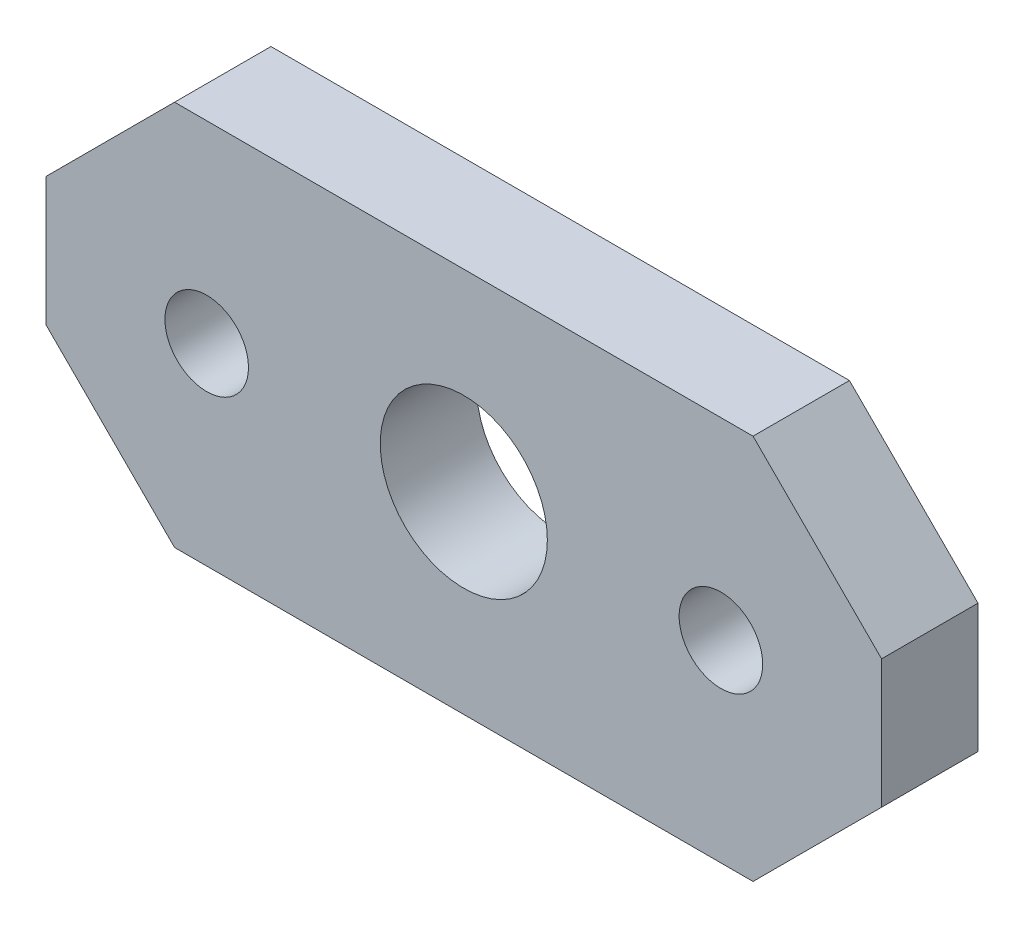
ISO-10303-21;
HEADER;
FILE_DESCRIPTION(('STEP AP214'),'2;1');
FILE_NAME('part.step','',(''),(''),'','','');
FILE_SCHEMA(('AUTOMOTIVE_DESIGN { 1 0 10303 214 1 1 1 1 }'));
ENDSEC;
DATA;
#1=APPLICATION_CONTEXT('core data for automotive mechanical design processes');
#2=APPLICATION_PROTOCOL_DEFINITION('international standard','automotive_design',2000,#1);
#3=PRODUCT_CONTEXT('',#1,'mechanical');
#4=PRODUCT('Part','Part','',(#3));
#5=PRODUCT_RELATED_PRODUCT_CATEGORY('part','',(#4));
#6=PRODUCT_DEFINITION_FORMATION('','',#4);
#7=PRODUCT_DEFINITION_CONTEXT('part definition',#1,'design');
#8=PRODUCT_DEFINITION('design','',#6,#7);
#9=PRODUCT_DEFINITION_SHAPE('','',#8);
#10=(LENGTH_UNIT() NAMED_UNIT(*) SI_UNIT(.MILLI.,.METRE.));
#11=(NAMED_UNIT(*) PLANE_ANGLE_UNIT() SI_UNIT($,.RADIAN.));
#12=(NAMED_UNIT(*) SI_UNIT($,.STERADIAN.) SOLID_ANGLE_UNIT());
#13=UNCERTAINTY_MEASURE_WITH_UNIT(LENGTH_MEASURE(1.E-05),#10,'distance_accuracy_value','');
#14=(GEOMETRIC_REPRESENTATION_CONTEXT(3) GLOBAL_UNCERTAINTY_ASSIGNED_CONTEXT((#13)) GLOBAL_UNIT_ASSIGNED_CONTEXT((#10,
#11,#12)) REPRESENTATION_CONTEXT('',''));
#15=CARTESIAN_POINT('',(0.,0.,0.));
#16=DIRECTION('',(0.,0.,1.));
#17=DIRECTION('',(1.,0.,0.));
#18=AXIS2_PLACEMENT_3D('',#15,#16,#17);
#19=CARTESIAN_POINT('',(0.,0.,3.));
#20=DIRECTION('',(0.,0.,1.));
#21=DIRECTION('',(1.,0.,0.));
#22=AXIS2_PLACEMENT_3D('',#19,#20,#21);
#23=PLANE('',#22);
#24=CARTESIAN_POINT('',(-8.,0.,3.));
#25=DIRECTION('',(0.,0.,1.));
#26=DIRECTION('',(1.,0.,0.));
#27=AXIS2_PLACEMENT_3D('',#24,#25,#26);
#28=CIRCLE('',#27,1.3);
#29=CARTESIAN_POINT('',(-6.7,0.,3.));
#30=VERTEX_POINT('',#29);
#31=EDGE_CURVE('E190',#30,#30,#28,.T.);
#32=ORIENTED_EDGE('',*,*,#31,.F.);
#33=EDGE_LOOP('',(#32));
#34=FACE_BOUND('',#33,.T.);
#35=DIRECTION('',(0.707106781186548,-0.707106781186548,0.));
#36=VECTOR('',#35,1.);
#37=CARTESIAN_POINT('',(-13.,-2.,3.));
#38=LINE('',#37,#36);
#39=CARTESIAN_POINT('',(-13.,-2.,3.));
#40=VERTEX_POINT('',#39);
#41=CARTESIAN_POINT('',(-9.,-6.,3.));
#42=VERTEX_POINT('',#41);
#43=EDGE_CURVE('E153',#40,#42,#38,.T.);
#44=ORIENTED_EDGE('',*,*,#43,.T.);
#45=DIRECTION('',(1.,0.,0.));
#46=VECTOR('',#45,1.);
#47=CARTESIAN_POINT('',(-9.,-6.,3.));
#48=LINE('',#47,#46);
#49=CARTESIAN_POINT('',(9.,-6.,3.));
#50=VERTEX_POINT('',#49);
#51=EDGE_CURVE('E101',#42,#50,#48,.T.);
#52=ORIENTED_EDGE('',*,*,#51,.T.);
#53=DIRECTION('',(0.707106781186548,0.707106781186548,0.));
#54=VECTOR('',#53,1.);
#55=CARTESIAN_POINT('',(9.,-6.,3.));
#56=LINE('',#55,#54);
#57=CARTESIAN_POINT('',(13.,-2.,3.));
#58=VERTEX_POINT('',#57);
#59=EDGE_CURVE('E168',#50,#58,#56,.T.);
#60=ORIENTED_EDGE('',*,*,#59,.T.);
#61=DIRECTION('',(0.,1.,0.));
#62=VECTOR('',#61,1.);
#63=CARTESIAN_POINT('',(13.,-2.,3.));
#64=LINE('',#63,#62);
#65=CARTESIAN_POINT('',(13.,2.,3.));
#66=VERTEX_POINT('',#65);
#67=EDGE_CURVE('E181',#58,#66,#64,.T.);
#68=ORIENTED_EDGE('',*,*,#67,.T.);
#69=DIRECTION('',(-0.707106781186548,0.707106781186548,0.));
#70=VECTOR('',#69,1.);
#71=CARTESIAN_POINT('',(13.,2.,3.));
#72=LINE('',#71,#70);
#73=CARTESIAN_POINT('',(9.,6.,3.));
#74=VERTEX_POINT('',#73);
#75=EDGE_CURVE('E120',#66,#74,#72,.T.);
#76=ORIENTED_EDGE('',*,*,#75,.T.);
#77=DIRECTION('',(-1.,0.,0.));
#78=VECTOR('',#77,1.);
#79=CARTESIAN_POINT('',(9.,6.,3.));
#80=LINE('',#79,#78);
#81=CARTESIAN_POINT('',(-9.,6.,3.));
#82=VERTEX_POINT('',#81);
#83=EDGE_CURVE('E114',#74,#82,#80,.T.);
#84=ORIENTED_EDGE('',*,*,#83,.T.);
#85=DIRECTION('',(-0.707106781186548,-0.707106781186548,0.));
#86=VECTOR('',#85,1.);
#87=CARTESIAN_POINT('',(-9.,6.,3.));
#88=LINE('',#87,#86);
#89=CARTESIAN_POINT('',(-13.,2.,3.));
#90=VERTEX_POINT('',#89);
#91=EDGE_CURVE('E118',#82,#90,#88,.T.);
#92=ORIENTED_EDGE('',*,*,#91,.T.);
#93=DIRECTION('',(0.,-1.,0.));
#94=VECTOR('',#93,1.);
#95=CARTESIAN_POINT('',(-13.,2.,3.));
#96=LINE('',#95,#94);
#97=EDGE_CURVE('E58',#90,#40,#96,.T.);
#98=ORIENTED_EDGE('',*,*,#97,.T.);
#99=EDGE_LOOP('',(#44,#52,#60,#68,#76,#84,#92,#98));
#100=FACE_BOUND('',#99,.T.);
#101=CARTESIAN_POINT('',(0.,0.,3.));
#102=DIRECTION('',(0.,0.,1.));
#103=DIRECTION('',(1.,0.,0.));
#104=AXIS2_PLACEMENT_3D('',#101,#102,#103);
#105=CIRCLE('',#104,2.6);
#106=CARTESIAN_POINT('',(2.6,0.,3.));
#107=VERTEX_POINT('',#106);
#108=EDGE_CURVE('E142',#107,#107,#105,.T.);
#109=ORIENTED_EDGE('',*,*,#108,.F.);
#110=EDGE_LOOP('',(#109));
#111=FACE_BOUND('',#110,.T.);
#112=CARTESIAN_POINT('',(8.,0.,3.));
#113=DIRECTION('',(0.,0.,1.));
#114=DIRECTION('',(1.,0.,0.));
#115=AXIS2_PLACEMENT_3D('',#112,#113,#114);
#116=CIRCLE('',#115,1.3);
#117=CARTESIAN_POINT('',(9.3,0.,3.));
#118=VERTEX_POINT('',#117);
#119=EDGE_CURVE('E196',#118,#118,#116,.T.);
#120=ORIENTED_EDGE('',*,*,#119,.F.);
#121=EDGE_LOOP('',(#120));
#122=FACE_BOUND('',#121,.T.);
#123=ADVANCED_FACE('F41',(#34,#100,#111,#122),#23,.T.);
#124=CARTESIAN_POINT('',(0.,0.,0.));
#125=DIRECTION('',(0.,0.,1.));
#126=DIRECTION('',(1.,0.,0.));
#127=AXIS2_PLACEMENT_3D('',#124,#125,#126);
#128=PLANE('',#127);
#129=DIRECTION('',(0.707106781186548,-0.707106781186548,0.));
#130=VECTOR('',#129,1.);
#131=CARTESIAN_POINT('',(-13.,-2.,0.));
#132=LINE('',#131,#130);
#133=CARTESIAN_POINT('',(-13.,-2.,0.));
#134=VERTEX_POINT('',#133);
#135=CARTESIAN_POINT('',(-9.,-6.,0.));
#136=VERTEX_POINT('',#135);
#137=EDGE_CURVE('E138',#134,#136,#132,.T.);
#138=ORIENTED_EDGE('',*,*,#137,.F.);
#139=DIRECTION('',(0.,-1.,0.));
#140=VECTOR('',#139,1.);
#141=CARTESIAN_POINT('',(-13.,2.,0.));
#142=LINE('',#141,#140);
#143=CARTESIAN_POINT('',(-13.,2.,0.));
#144=VERTEX_POINT('',#143);
#145=EDGE_CURVE('E93',#144,#134,#142,.T.);
#146=ORIENTED_EDGE('',*,*,#145,.F.);
#147=DIRECTION('',(-0.707106781186548,-0.707106781186548,0.));
#148=VECTOR('',#147,1.);
#149=CARTESIAN_POINT('',(-9.,6.,0.));
#150=LINE('',#149,#148);
#151=CARTESIAN_POINT('',(-9.,6.,0.));
#152=VERTEX_POINT('',#151);
#153=EDGE_CURVE('E87',#152,#144,#150,.T.);
#154=ORIENTED_EDGE('',*,*,#153,.F.);
#155=DIRECTION('',(-1.,0.,0.));
#156=VECTOR('',#155,1.);
#157=CARTESIAN_POINT('',(9.,6.,0.));
#158=LINE('',#157,#156);
#159=CARTESIAN_POINT('',(9.,6.,0.));
#160=VERTEX_POINT('',#159);
#161=EDGE_CURVE('E128',#160,#152,#158,.T.);
#162=ORIENTED_EDGE('',*,*,#161,.F.);
#163=DIRECTION('',(-0.707106781186548,0.707106781186548,0.));
#164=VECTOR('',#163,1.);
#165=CARTESIAN_POINT('',(13.,2.,0.));
#166=LINE('',#165,#164);
#167=CARTESIAN_POINT('',(13.,2.,0.));
#168=VERTEX_POINT('',#167);
#169=EDGE_CURVE('E148',#168,#160,#166,.T.);
#170=ORIENTED_EDGE('',*,*,#169,.F.);
#171=DIRECTION('',(0.,1.,0.));
#172=VECTOR('',#171,1.);
#173=CARTESIAN_POINT('',(13.,-2.,0.));
#174=LINE('',#173,#172);
#175=CARTESIAN_POINT('',(13.,-2.,0.));
#176=VERTEX_POINT('',#175);
#177=EDGE_CURVE('E146',#176,#168,#174,.T.);
#178=ORIENTED_EDGE('',*,*,#177,.F.);
#179=DIRECTION('',(0.707106781186548,0.707106781186548,0.));
#180=VECTOR('',#179,1.);
#181=CARTESIAN_POINT('',(9.,-6.,0.));
#182=LINE('',#181,#180);
#183=CARTESIAN_POINT('',(9.,-6.,0.));
#184=VERTEX_POINT('',#183);
#185=EDGE_CURVE('E144',#184,#176,#182,.T.);
#186=ORIENTED_EDGE('',*,*,#185,.F.);
#187=DIRECTION('',(1.,0.,0.));
#188=VECTOR('',#187,1.);
#189=CARTESIAN_POINT('',(-9.,-6.,0.));
#190=LINE('',#189,#188);
#191=EDGE_CURVE('E141',#136,#184,#190,.T.);
#192=ORIENTED_EDGE('',*,*,#191,.F.);
#193=EDGE_LOOP('',(#138,#146,#154,#162,#170,#178,#186,#192));
#194=FACE_BOUND('',#193,.T.);
#195=CARTESIAN_POINT('',(0.,0.,0.));
#196=DIRECTION('',(0.,0.,1.));
#197=DIRECTION('',(1.,0.,0.));
#198=AXIS2_PLACEMENT_3D('',#195,#196,#197);
#199=CIRCLE('',#198,2.6);
#200=CARTESIAN_POINT('',(2.6,0.,0.));
#201=VERTEX_POINT('',#200);
#202=EDGE_CURVE('E187',#201,#201,#199,.T.);
#203=ORIENTED_EDGE('',*,*,#202,.T.);
#204=EDGE_LOOP('',(#203));
#205=FACE_BOUND('',#204,.T.);
#206=CARTESIAN_POINT('',(-8.,0.,0.));
#207=DIRECTION('',(0.,0.,1.));
#208=DIRECTION('',(1.,0.,0.));
#209=AXIS2_PLACEMENT_3D('',#206,#207,#208);
#210=CIRCLE('',#209,1.3);
#211=CARTESIAN_POINT('',(-6.7,0.,0.));
#212=VERTEX_POINT('',#211);
#213=EDGE_CURVE('E193',#212,#212,#210,.T.);
#214=ORIENTED_EDGE('',*,*,#213,.T.);
#215=EDGE_LOOP('',(#214));
#216=FACE_BOUND('',#215,.T.);
#217=CARTESIAN_POINT('',(8.,0.,0.));
#218=DIRECTION('',(0.,0.,1.));
#219=DIRECTION('',(1.,0.,0.));
#220=AXIS2_PLACEMENT_3D('',#217,#218,#219);
#221=CIRCLE('',#220,1.3);
#222=CARTESIAN_POINT('',(9.3,0.,0.));
#223=VERTEX_POINT('',#222);
#224=EDGE_CURVE('E199',#223,#223,#221,.T.);
#225=ORIENTED_EDGE('',*,*,#224,.T.);
#226=EDGE_LOOP('',(#225));
#227=FACE_BOUND('',#226,.T.);
#228=ADVANCED_FACE('F172',(#194,#205,#216,#227),#128,.F.);
#229=CARTESIAN_POINT('',(-13.,-2.,3.));
#230=DIRECTION('',(0.707106781186547,0.707106781186547,0.));
#231=DIRECTION('',(-0.707106781186548,0.707106781186548,0.));
#232=AXIS2_PLACEMENT_3D('',#229,#230,#231);
#233=PLANE('',#232);
#234=ORIENTED_EDGE('',*,*,#137,.T.);
#235=DIRECTION('',(0.,0.,-1.));
#236=VECTOR('',#235,1.);
#237=CARTESIAN_POINT('',(-9.,-6.,3.));
#238=LINE('',#237,#236);
#239=EDGE_CURVE('E11',#42,#136,#238,.T.);
#240=ORIENTED_EDGE('',*,*,#239,.F.);
#241=ORIENTED_EDGE('',*,*,#43,.F.);
#242=DIRECTION('',(0.,0.,-1.));
#243=VECTOR('',#242,1.);
#244=CARTESIAN_POINT('',(-13.,-2.,3.));
#245=LINE('',#244,#243);
#246=EDGE_CURVE('E134',#40,#134,#245,.T.);
#247=ORIENTED_EDGE('',*,*,#246,.T.);
#248=EDGE_LOOP('',(#234,#240,#241,#247));
#249=FACE_BOUND('',#248,.T.);
#250=ADVANCED_FACE('F43',(#249),#233,.F.);
#251=CARTESIAN_POINT('',(-9.,-6.,3.));
#252=DIRECTION('',(0.,1.,0.));
#253=DIRECTION('',(0.,0.,1.));
#254=AXIS2_PLACEMENT_3D('',#251,#252,#253);
#255=PLANE('',#254);
#256=ORIENTED_EDGE('',*,*,#191,.T.);
#257=DIRECTION('',(0.,0.,-1.));
#258=VECTOR('',#257,1.);
#259=CARTESIAN_POINT('',(9.,-6.,3.));
#260=LINE('',#259,#258);
#261=EDGE_CURVE('E50',#50,#184,#260,.T.);
#262=ORIENTED_EDGE('',*,*,#261,.F.);
#263=ORIENTED_EDGE('',*,*,#51,.F.);
#264=ORIENTED_EDGE('',*,*,#239,.T.);
#265=EDGE_LOOP('',(#256,#262,#263,#264));
#266=FACE_BOUND('',#265,.T.);
#267=ADVANCED_FACE('F232',(#266),#255,.F.);
#268=CARTESIAN_POINT('',(9.,-6.,3.));
#269=DIRECTION('',(-0.707106781186547,0.707106781186547,0.));
#270=DIRECTION('',(-0.707106781186548,-0.707106781186548,0.));
#271=AXIS2_PLACEMENT_3D('',#268,#269,#270);
#272=PLANE('',#271);
#273=ORIENTED_EDGE('',*,*,#185,.T.);
#274=DIRECTION('',(0.,0.,-1.));
#275=VECTOR('',#274,1.);
#276=CARTESIAN_POINT('',(13.,-2.,3.));
#277=LINE('',#276,#275);
#278=EDGE_CURVE('E160',#58,#176,#277,.T.);
#279=ORIENTED_EDGE('',*,*,#278,.F.);
#280=ORIENTED_EDGE('',*,*,#59,.F.);
#281=ORIENTED_EDGE('',*,*,#261,.T.);
#282=EDGE_LOOP('',(#273,#279,#280,#281));
#283=FACE_BOUND('',#282,.T.);
#284=ADVANCED_FACE('F166',(#283),#272,.F.);
#285=CARTESIAN_POINT('',(13.,-2.,3.));
#286=DIRECTION('',(-1.,0.,0.));
#287=DIRECTION('',(0.,0.,1.));
#288=AXIS2_PLACEMENT_3D('',#285,#286,#287);
#289=PLANE('',#288);
#290=ORIENTED_EDGE('',*,*,#177,.T.);
#291=DIRECTION('',(0.,0.,-1.));
#292=VECTOR('',#291,1.);
#293=CARTESIAN_POINT('',(13.,2.,3.));
#294=LINE('',#293,#292);
#295=EDGE_CURVE('E157',#66,#168,#294,.T.);
#296=ORIENTED_EDGE('',*,*,#295,.F.);
#297=ORIENTED_EDGE('',*,*,#67,.F.);
#298=ORIENTED_EDGE('',*,*,#278,.T.);
#299=EDGE_LOOP('',(#290,#296,#297,#298));
#300=FACE_BOUND('',#299,.T.);
#301=ADVANCED_FACE('F177',(#300),#289,.F.);
#302=CARTESIAN_POINT('',(13.,2.,3.));
#303=DIRECTION('',(-0.707106781186547,-0.707106781186547,0.));
#304=DIRECTION('',(0.707106781186548,-0.707106781186548,0.));
#305=AXIS2_PLACEMENT_3D('',#302,#303,#304);
#306=PLANE('',#305);
#307=ORIENTED_EDGE('',*,*,#169,.T.);
#308=DIRECTION('',(0.,0.,-1.));
#309=VECTOR('',#308,1.);
#310=CARTESIAN_POINT('',(9.,6.,3.));
#311=LINE('',#310,#309);
#312=EDGE_CURVE('E129',#74,#160,#311,.T.);
#313=ORIENTED_EDGE('',*,*,#312,.F.);
#314=ORIENTED_EDGE('',*,*,#75,.F.);
#315=ORIENTED_EDGE('',*,*,#295,.T.);
#316=EDGE_LOOP('',(#307,#313,#314,#315));
#317=FACE_BOUND('',#316,.T.);
#318=ADVANCED_FACE('F180',(#317),#306,.F.);
#319=CARTESIAN_POINT('',(9.,6.,3.));
#320=DIRECTION('',(0.,-1.,0.));
#321=DIRECTION('',(0.,0.,-1.));
#322=AXIS2_PLACEMENT_3D('',#319,#320,#321);
#323=PLANE('',#322);
#324=ORIENTED_EDGE('',*,*,#161,.T.);
#325=DIRECTION('',(0.,0.,-1.));
#326=VECTOR('',#325,1.);
#327=CARTESIAN_POINT('',(-9.,6.,3.));
#328=LINE('',#327,#326);
#329=EDGE_CURVE('E125',#82,#152,#328,.T.);
#330=ORIENTED_EDGE('',*,*,#329,.F.);
#331=ORIENTED_EDGE('',*,*,#83,.F.);
#332=ORIENTED_EDGE('',*,*,#312,.T.);
#333=EDGE_LOOP('',(#324,#330,#331,#332));
#334=FACE_BOUND('',#333,.T.);
#335=ADVANCED_FACE('F126',(#334),#323,.F.);
#336=CARTESIAN_POINT('',(-9.,6.,3.));
#337=DIRECTION('',(0.707106781186547,-0.707106781186547,0.));
#338=DIRECTION('',(0.707106781186548,0.707106781186548,0.));
#339=AXIS2_PLACEMENT_3D('',#336,#337,#338);
#340=PLANE('',#339);
#341=ORIENTED_EDGE('',*,*,#153,.T.);
#342=DIRECTION('',(0.,0.,-1.));
#343=VECTOR('',#342,1.);
#344=CARTESIAN_POINT('',(-13.,2.,3.));
#345=LINE('',#344,#343);
#346=EDGE_CURVE('E130',#90,#144,#345,.T.);
#347=ORIENTED_EDGE('',*,*,#346,.F.);
#348=ORIENTED_EDGE('',*,*,#91,.F.);
#349=ORIENTED_EDGE('',*,*,#329,.T.);
#350=EDGE_LOOP('',(#341,#347,#348,#349));
#351=FACE_BOUND('',#350,.T.);
#352=ADVANCED_FACE('F132',(#351),#340,.F.);
#353=CARTESIAN_POINT('',(-13.,2.,3.));
#354=DIRECTION('',(1.,0.,0.));
#355=DIRECTION('',(0.,0.,-1.));
#356=AXIS2_PLACEMENT_3D('',#353,#354,#355);
#357=PLANE('',#356);
#358=ORIENTED_EDGE('',*,*,#145,.T.);
#359=ORIENTED_EDGE('',*,*,#246,.F.);
#360=ORIENTED_EDGE('',*,*,#97,.F.);
#361=ORIENTED_EDGE('',*,*,#346,.T.);
#362=EDGE_LOOP('',(#358,#359,#360,#361));
#363=FACE_BOUND('',#362,.T.);
#364=ADVANCED_FACE('F220',(#363),#357,.F.);
#365=CARTESIAN_POINT('',(0.,0.,3.));
#366=DIRECTION('',(0.,0.,-1.));
#367=DIRECTION('',(-1.,0.,0.));
#368=AXIS2_PLACEMENT_3D('',#365,#366,#367);
#369=CYLINDRICAL_SURFACE('',#368,2.6);
#370=ORIENTED_EDGE('',*,*,#108,.T.);
#371=EDGE_LOOP('',(#370));
#372=FACE_BOUND('',#371,.T.);
#373=ORIENTED_EDGE('',*,*,#202,.F.);
#374=EDGE_LOOP('',(#373));
#375=FACE_BOUND('',#374,.T.);
#376=ADVANCED_FACE('F217',(#372,#375),#369,.F.);
#377=CARTESIAN_POINT('',(-8.,0.,3.));
#378=DIRECTION('',(0.,0.,-1.));
#379=DIRECTION('',(-1.,0.,0.));
#380=AXIS2_PLACEMENT_3D('',#377,#378,#379);
#381=CYLINDRICAL_SURFACE('',#380,1.3);
#382=ORIENTED_EDGE('',*,*,#31,.T.);
#383=EDGE_LOOP('',(#382));
#384=FACE_BOUND('',#383,.T.);
#385=ORIENTED_EDGE('',*,*,#213,.F.);
#386=EDGE_LOOP('',(#385));
#387=FACE_BOUND('',#386,.T.);
#388=ADVANCED_FACE('F308',(#384,#387),#381,.F.);
#389=CARTESIAN_POINT('',(8.,0.,3.));
#390=DIRECTION('',(0.,0.,-1.));
#391=DIRECTION('',(-1.,0.,0.));
#392=AXIS2_PLACEMENT_3D('',#389,#390,#391);
#393=CYLINDRICAL_SURFACE('',#392,1.3);
#394=ORIENTED_EDGE('',*,*,#119,.T.);
#395=EDGE_LOOP('',(#394));
#396=FACE_BOUND('',#395,.T.);
#397=ORIENTED_EDGE('',*,*,#224,.F.);
#398=EDGE_LOOP('',(#397));
#399=FACE_BOUND('',#398,.T.);
#400=ADVANCED_FACE('F205',(#396,#399),#393,.F.);
#401=CLOSED_SHELL('',(#123,#228,#250,#267,#284,#301,#318,#335,#352,#364,#376,#388,#400));
#402=MANIFOLD_SOLID_BREP('B2',#401);
#403=ADVANCED_BREP_SHAPE_REPRESENTATION('',(#18,#402),#14);
#404=SHAPE_DEFINITION_REPRESENTATION(#9,#403);
ENDSEC;
END-ISO-10303-21;
